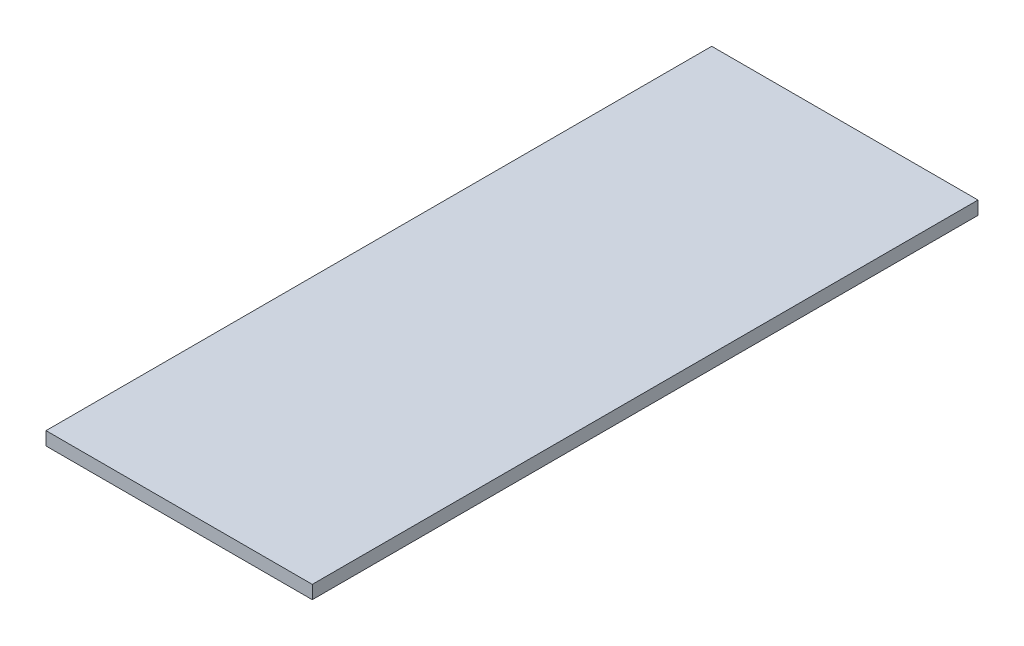
ISO-10303-21;
HEADER;
FILE_DESCRIPTION(('STEP AP214'),'2;1');
FILE_NAME('part.step','',(''),(''),'','','');
FILE_SCHEMA(('AUTOMOTIVE_DESIGN { 1 0 10303 214 1 1 1 1 }'));
ENDSEC;
DATA;
#1=APPLICATION_CONTEXT('core data for automotive mechanical design processes');
#2=APPLICATION_PROTOCOL_DEFINITION('international standard','automotive_design',2000,#1);
#3=PRODUCT_CONTEXT('',#1,'mechanical');
#4=PRODUCT('Part','Part','',(#3));
#5=PRODUCT_RELATED_PRODUCT_CATEGORY('part','',(#4));
#6=PRODUCT_DEFINITION_FORMATION('','',#4);
#7=PRODUCT_DEFINITION_CONTEXT('part definition',#1,'design');
#8=PRODUCT_DEFINITION('design','',#6,#7);
#9=PRODUCT_DEFINITION_SHAPE('','',#8);
#10=(LENGTH_UNIT() NAMED_UNIT(*) SI_UNIT(.MILLI.,.METRE.));
#11=(NAMED_UNIT(*) PLANE_ANGLE_UNIT() SI_UNIT($,.RADIAN.));
#12=(NAMED_UNIT(*) SI_UNIT($,.STERADIAN.) SOLID_ANGLE_UNIT());
#13=UNCERTAINTY_MEASURE_WITH_UNIT(LENGTH_MEASURE(1.E-05),#10,'distance_accuracy_value','');
#14=(GEOMETRIC_REPRESENTATION_CONTEXT(3) GLOBAL_UNCERTAINTY_ASSIGNED_CONTEXT((#13)) GLOBAL_UNIT_ASSIGNED_CONTEXT((#10,
#11,#12)) REPRESENTATION_CONTEXT('',''));
#15=CARTESIAN_POINT('',(0.,0.,0.));
#16=DIRECTION('',(0.,0.,1.));
#17=DIRECTION('',(1.,0.,0.));
#18=AXIS2_PLACEMENT_3D('',#15,#16,#17);
#19=CARTESIAN_POINT('',(-60.,6.,150.));
#20=DIRECTION('',(1.,0.,0.));
#21=DIRECTION('',(0.,0.,-1.));
#22=AXIS2_PLACEMENT_3D('',#19,#20,#21);
#23=PLANE('',#22);
#24=DIRECTION('',(0.,0.,1.));
#25=VECTOR('',#24,1.);
#26=CARTESIAN_POINT('',(-60.,0.,150.));
#27=LINE('',#26,#25);
#28=CARTESIAN_POINT('',(-60.,0.,-150.));
#29=VERTEX_POINT('',#28);
#30=CARTESIAN_POINT('',(-60.,0.,150.));
#31=VERTEX_POINT('',#30);
#32=EDGE_CURVE('E115',#29,#31,#27,.T.);
#33=ORIENTED_EDGE('',*,*,#32,.T.);
#34=DIRECTION('',(0.,-1.,0.));
#35=VECTOR('',#34,1.);
#36=CARTESIAN_POINT('',(-60.,6.,150.));
#37=LINE('',#36,#35);
#38=CARTESIAN_POINT('',(-60.,6.,150.));
#39=VERTEX_POINT('',#38);
#40=EDGE_CURVE('E11',#39,#31,#37,.T.);
#41=ORIENTED_EDGE('',*,*,#40,.F.);
#42=DIRECTION('',(0.,0.,1.));
#43=VECTOR('',#42,1.);
#44=CARTESIAN_POINT('',(-60.,6.,150.));
#45=LINE('',#44,#43);
#46=CARTESIAN_POINT('',(-60.,6.,-150.));
#47=VERTEX_POINT('',#46);
#48=EDGE_CURVE('E92',#47,#39,#45,.T.);
#49=ORIENTED_EDGE('',*,*,#48,.F.);
#50=DIRECTION('',(0.,-1.,0.));
#51=VECTOR('',#50,1.);
#52=CARTESIAN_POINT('',(-60.,6.,-150.));
#53=LINE('',#52,#51);
#54=EDGE_CURVE('E107',#47,#29,#53,.T.);
#55=ORIENTED_EDGE('',*,*,#54,.T.);
#56=EDGE_LOOP('',(#33,#41,#49,#55));
#57=FACE_BOUND('',#56,.T.);
#58=ADVANCED_FACE('F43',(#57),#23,.F.);
#59=CARTESIAN_POINT('',(-60.,6.,150.));
#60=DIRECTION('',(0.,0.,-1.));
#61=DIRECTION('',(-1.,0.,0.));
#62=AXIS2_PLACEMENT_3D('',#59,#60,#61);
#63=PLANE('',#62);
#64=DIRECTION('',(1.,0.,0.));
#65=VECTOR('',#64,1.);
#66=CARTESIAN_POINT('',(-60.,0.,150.));
#67=LINE('',#66,#65);
#68=CARTESIAN_POINT('',(60.,0.,150.));
#69=VERTEX_POINT('',#68);
#70=EDGE_CURVE('E99',#31,#69,#67,.T.);
#71=ORIENTED_EDGE('',*,*,#70,.T.);
#72=DIRECTION('',(0.,-1.,0.));
#73=VECTOR('',#72,1.);
#74=CARTESIAN_POINT('',(60.,6.,150.));
#75=LINE('',#74,#73);
#76=CARTESIAN_POINT('',(60.,6.,150.));
#77=VERTEX_POINT('',#76);
#78=EDGE_CURVE('E55',#77,#69,#75,.T.);
#79=ORIENTED_EDGE('',*,*,#78,.F.);
#80=DIRECTION('',(1.,0.,0.));
#81=VECTOR('',#80,1.);
#82=CARTESIAN_POINT('',(-60.,6.,150.));
#83=LINE('',#82,#81);
#84=EDGE_CURVE('E89',#39,#77,#83,.T.);
#85=ORIENTED_EDGE('',*,*,#84,.F.);
#86=ORIENTED_EDGE('',*,*,#40,.T.);
#87=EDGE_LOOP('',(#71,#79,#85,#86));
#88=FACE_BOUND('',#87,.T.);
#89=ADVANCED_FACE('F97',(#88),#63,.F.);
#90=CARTESIAN_POINT('',(60.,6.,150.));
#91=DIRECTION('',(-1.,0.,0.));
#92=DIRECTION('',(0.,0.,1.));
#93=AXIS2_PLACEMENT_3D('',#90,#91,#92);
#94=PLANE('',#93);
#95=DIRECTION('',(0.,0.,-1.));
#96=VECTOR('',#95,1.);
#97=CARTESIAN_POINT('',(60.,0.,150.));
#98=LINE('',#97,#96);
#99=CARTESIAN_POINT('',(60.,0.,-150.));
#100=VERTEX_POINT('',#99);
#101=EDGE_CURVE('E76',#69,#100,#98,.T.);
#102=ORIENTED_EDGE('',*,*,#101,.T.);
#103=DIRECTION('',(0.,-1.,0.));
#104=VECTOR('',#103,1.);
#105=CARTESIAN_POINT('',(60.,6.,-150.));
#106=LINE('',#105,#104);
#107=CARTESIAN_POINT('',(60.,6.,-150.));
#108=VERTEX_POINT('',#107);
#109=EDGE_CURVE('E105',#108,#100,#106,.T.);
#110=ORIENTED_EDGE('',*,*,#109,.F.);
#111=DIRECTION('',(0.,0.,-1.));
#112=VECTOR('',#111,1.);
#113=CARTESIAN_POINT('',(60.,6.,150.));
#114=LINE('',#113,#112);
#115=EDGE_CURVE('E91',#77,#108,#114,.T.);
#116=ORIENTED_EDGE('',*,*,#115,.F.);
#117=ORIENTED_EDGE('',*,*,#78,.T.);
#118=EDGE_LOOP('',(#102,#110,#116,#117));
#119=FACE_BOUND('',#118,.T.);
#120=ADVANCED_FACE('F103',(#119),#94,.F.);
#121=CARTESIAN_POINT('',(-60.,6.,-150.));
#122=DIRECTION('',(0.,0.,1.));
#123=DIRECTION('',(1.,0.,0.));
#124=AXIS2_PLACEMENT_3D('',#121,#122,#123);
#125=PLANE('',#124);
#126=DIRECTION('',(-1.,0.,0.));
#127=VECTOR('',#126,1.);
#128=CARTESIAN_POINT('',(-60.,0.,-150.));
#129=LINE('',#128,#127);
#130=EDGE_CURVE('E82',#100,#29,#129,.T.);
#131=ORIENTED_EDGE('',*,*,#130,.T.);
#132=ORIENTED_EDGE('',*,*,#54,.F.);
#133=DIRECTION('',(-1.,0.,0.));
#134=VECTOR('',#133,1.);
#135=CARTESIAN_POINT('',(-60.,6.,-150.));
#136=LINE('',#135,#134);
#137=EDGE_CURVE('E58',#108,#47,#136,.T.);
#138=ORIENTED_EDGE('',*,*,#137,.F.);
#139=ORIENTED_EDGE('',*,*,#109,.T.);
#140=EDGE_LOOP('',(#131,#132,#138,#139));
#141=FACE_BOUND('',#140,.T.);
#142=ADVANCED_FACE('F124',(#141),#125,.F.);
#143=CARTESIAN_POINT('',(0.,6.,0.));
#144=DIRECTION('',(0.,-1.,0.));
#145=DIRECTION('',(0.,0.,-1.));
#146=AXIS2_PLACEMENT_3D('',#143,#144,#145);
#147=PLANE('',#146);
#148=ORIENTED_EDGE('',*,*,#48,.T.);
#149=ORIENTED_EDGE('',*,*,#84,.T.);
#150=ORIENTED_EDGE('',*,*,#115,.T.);
#151=ORIENTED_EDGE('',*,*,#137,.T.);
#152=EDGE_LOOP('',(#148,#149,#150,#151));
#153=FACE_BOUND('',#152,.T.);
#154=ADVANCED_FACE('F93',(#153),#147,.F.);
#155=CARTESIAN_POINT('',(0.,0.,0.));
#156=DIRECTION('',(0.,-1.,0.));
#157=DIRECTION('',(0.,0.,-1.));
#158=AXIS2_PLACEMENT_3D('',#155,#156,#157);
#159=PLANE('',#158);
#160=ORIENTED_EDGE('',*,*,#32,.F.);
#161=ORIENTED_EDGE('',*,*,#130,.F.);
#162=ORIENTED_EDGE('',*,*,#101,.F.);
#163=ORIENTED_EDGE('',*,*,#70,.F.);
#164=EDGE_LOOP('',(#160,#161,#162,#163));
#165=FACE_BOUND('',#164,.T.);
#166=ADVANCED_FACE('F126',(#165),#159,.T.);
#167=CLOSED_SHELL('',(#58,#89,#120,#142,#154,#166));
#168=MANIFOLD_SOLID_BREP('B2',#167);
#169=ADVANCED_BREP_SHAPE_REPRESENTATION('',(#18,#168),#14);
#170=SHAPE_DEFINITION_REPRESENTATION(#9,#169);
ENDSEC;
END-ISO-10303-21;
